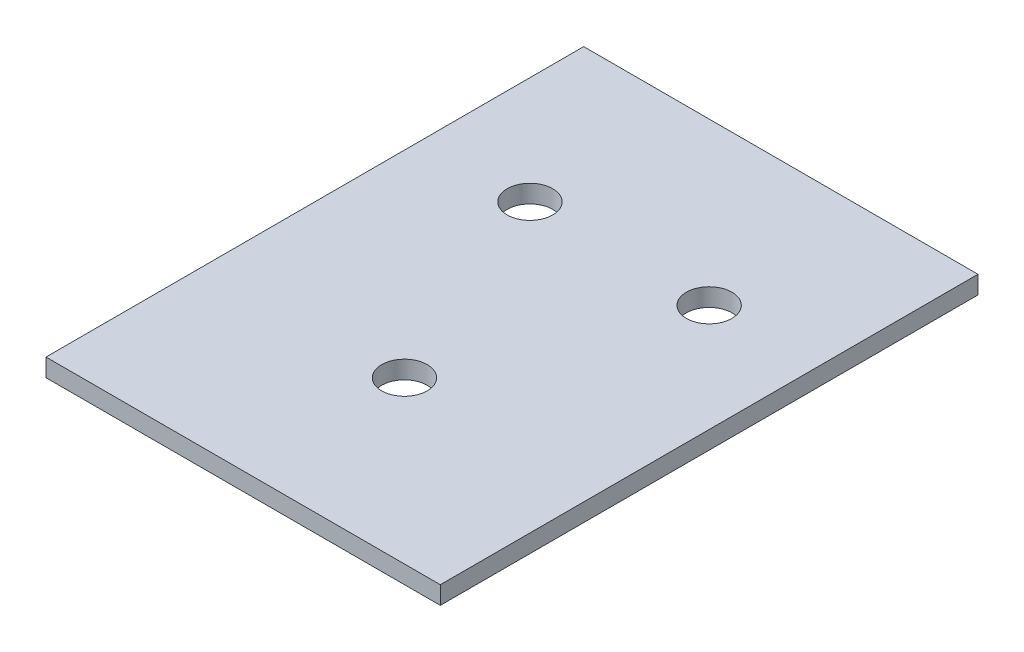
ISO-10303-21;
HEADER;
FILE_DESCRIPTION(('STEP AP214'),'2;1');
FILE_NAME('part.step','',(''),(''),'','','');
FILE_SCHEMA(('AUTOMOTIVE_DESIGN { 1 0 10303 214 1 1 1 1 }'));
ENDSEC;
DATA;
#1=APPLICATION_CONTEXT('core data for automotive mechanical design processes');
#2=APPLICATION_PROTOCOL_DEFINITION('international standard','automotive_design',2000,#1);
#3=PRODUCT_CONTEXT('',#1,'mechanical');
#4=PRODUCT('Part','Part','',(#3));
#5=PRODUCT_RELATED_PRODUCT_CATEGORY('part','',(#4));
#6=PRODUCT_DEFINITION_FORMATION('','',#4);
#7=PRODUCT_DEFINITION_CONTEXT('part definition',#1,'design');
#8=PRODUCT_DEFINITION('design','',#6,#7);
#9=PRODUCT_DEFINITION_SHAPE('','',#8);
#10=(LENGTH_UNIT() NAMED_UNIT(*) SI_UNIT(.MILLI.,.METRE.));
#11=(NAMED_UNIT(*) PLANE_ANGLE_UNIT() SI_UNIT($,.RADIAN.));
#12=(NAMED_UNIT(*) SI_UNIT($,.STERADIAN.) SOLID_ANGLE_UNIT());
#13=UNCERTAINTY_MEASURE_WITH_UNIT(LENGTH_MEASURE(1.E-05),#10,'distance_accuracy_value','');
#14=(GEOMETRIC_REPRESENTATION_CONTEXT(3) GLOBAL_UNCERTAINTY_ASSIGNED_CONTEXT((#13)) GLOBAL_UNIT_ASSIGNED_CONTEXT((#10,
#11,#12)) REPRESENTATION_CONTEXT('',''));
#15=CARTESIAN_POINT('',(0.,0.,0.));
#16=DIRECTION('',(0.,0.,1.));
#17=DIRECTION('',(1.,0.,0.));
#18=AXIS2_PLACEMENT_3D('',#15,#16,#17);
#19=CARTESIAN_POINT('',(0.,100.,210.));
#20=DIRECTION('',(0.,1.,0.));
#21=DIRECTION('',(0.,0.,1.));
#22=AXIS2_PLACEMENT_3D('',#19,#20,#21);
#23=CYLINDRICAL_SURFACE('',#22,12.7);
#24=DIRECTION('',(0.,1.,0.));
#25=VECTOR('',#24,1.);
#26=CARTESIAN_POINT('',(0.,100.,222.7));
#27=LINE('',#26,#25);
#28=CARTESIAN_POINT('',(0.,100.,222.7));
#29=VERTEX_POINT('',#28);
#30=CARTESIAN_POINT('',(0.,110.,222.7));
#31=VERTEX_POINT('',#30);
#32=EDGE_CURVE('E10',#29,#31,#27,.T.);
#33=ORIENTED_EDGE('',*,*,#32,.F.);
#34=CARTESIAN_POINT('',(0.,100.,210.));
#35=DIRECTION('',(0.,1.,0.));
#36=DIRECTION('',(0.,0.,1.));
#37=AXIS2_PLACEMENT_3D('',#34,#35,#36);
#38=CIRCLE('',#37,12.7);
#39=EDGE_CURVE('E107',#29,#29,#38,.T.);
#40=ORIENTED_EDGE('',*,*,#39,.F.);
#41=ORIENTED_EDGE('',*,*,#32,.T.);
#42=CARTESIAN_POINT('',(0.,110.,210.));
#43=DIRECTION('',(0.,1.,0.));
#44=DIRECTION('',(0.,0.,1.));
#45=AXIS2_PLACEMENT_3D('',#42,#43,#44);
#46=CIRCLE('',#45,12.7);
#47=EDGE_CURVE('E113',#31,#31,#46,.T.);
#48=ORIENTED_EDGE('',*,*,#47,.T.);
#49=EDGE_LOOP('',(#33,#40,#41,#48));
#50=FACE_BOUND('',#49,.T.);
#51=ADVANCED_FACE('F16',(#50),#23,.F.);
#52=CARTESIAN_POINT('',(50.,100.,90.));
#53=DIRECTION('',(0.,1.,0.));
#54=DIRECTION('',(0.,0.,1.));
#55=AXIS2_PLACEMENT_3D('',#52,#53,#54);
#56=CYLINDRICAL_SURFACE('',#55,12.7);
#57=DIRECTION('',(0.,1.,0.));
#58=VECTOR('',#57,1.);
#59=CARTESIAN_POINT('',(50.,100.,102.7));
#60=LINE('',#59,#58);
#61=CARTESIAN_POINT('',(50.,100.,102.7));
#62=VERTEX_POINT('',#61);
#63=CARTESIAN_POINT('',(50.,110.,102.7));
#64=VERTEX_POINT('',#63);
#65=EDGE_CURVE('E26',#62,#64,#60,.T.);
#66=ORIENTED_EDGE('',*,*,#65,.F.);
#67=CARTESIAN_POINT('',(50.,100.,90.));
#68=DIRECTION('',(0.,1.,0.));
#69=DIRECTION('',(0.,0.,1.));
#70=AXIS2_PLACEMENT_3D('',#67,#68,#69);
#71=CIRCLE('',#70,12.7);
#72=EDGE_CURVE('E99',#62,#62,#71,.T.);
#73=ORIENTED_EDGE('',*,*,#72,.F.);
#74=ORIENTED_EDGE('',*,*,#65,.T.);
#75=CARTESIAN_POINT('',(50.,110.,90.));
#76=DIRECTION('',(0.,1.,0.));
#77=DIRECTION('',(0.,0.,1.));
#78=AXIS2_PLACEMENT_3D('',#75,#76,#77);
#79=CIRCLE('',#78,12.7);
#80=EDGE_CURVE('E114',#64,#64,#79,.T.);
#81=ORIENTED_EDGE('',*,*,#80,.T.);
#82=EDGE_LOOP('',(#66,#73,#74,#81));
#83=FACE_BOUND('',#82,.T.);
#84=ADVANCED_FACE('F226',(#83),#56,.F.);
#85=CARTESIAN_POINT('',(-50.,100.,90.));
#86=DIRECTION('',(0.,1.,0.));
#87=DIRECTION('',(0.,0.,1.));
#88=AXIS2_PLACEMENT_3D('',#85,#86,#87);
#89=CYLINDRICAL_SURFACE('',#88,12.7);
#90=DIRECTION('',(0.,1.,0.));
#91=VECTOR('',#90,1.);
#92=CARTESIAN_POINT('',(-50.,100.,102.7));
#93=LINE('',#92,#91);
#94=CARTESIAN_POINT('',(-50.,100.,102.7));
#95=VERTEX_POINT('',#94);
#96=CARTESIAN_POINT('',(-50.,110.,102.7));
#97=VERTEX_POINT('',#96);
#98=EDGE_CURVE('E86',#95,#97,#93,.T.);
#99=ORIENTED_EDGE('',*,*,#98,.F.);
#100=CARTESIAN_POINT('',(-50.,100.,90.));
#101=DIRECTION('',(0.,1.,0.));
#102=DIRECTION('',(0.,0.,1.));
#103=AXIS2_PLACEMENT_3D('',#100,#101,#102);
#104=CIRCLE('',#103,12.7);
#105=EDGE_CURVE('E89',#95,#95,#104,.T.);
#106=ORIENTED_EDGE('',*,*,#105,.F.);
#107=ORIENTED_EDGE('',*,*,#98,.T.);
#108=CARTESIAN_POINT('',(-50.,110.,90.));
#109=DIRECTION('',(0.,1.,0.));
#110=DIRECTION('',(0.,0.,1.));
#111=AXIS2_PLACEMENT_3D('',#108,#109,#110);
#112=CIRCLE('',#111,12.7);
#113=EDGE_CURVE('E91',#97,#97,#112,.T.);
#114=ORIENTED_EDGE('',*,*,#113,.T.);
#115=EDGE_LOOP('',(#99,#106,#107,#114));
#116=FACE_BOUND('',#115,.T.);
#117=ADVANCED_FACE('F88',(#116),#89,.F.);
#118=CARTESIAN_POINT('',(110.,100.,0.));
#119=DIRECTION('',(1.,0.,0.));
#120=DIRECTION('',(0.,1.,0.));
#121=AXIS2_PLACEMENT_3D('',#118,#119,#120);
#122=PLANE('',#121);
#123=DIRECTION('',(0.,0.,1.));
#124=VECTOR('',#123,1.);
#125=CARTESIAN_POINT('',(110.,100.,0.));
#126=LINE('',#125,#124);
#127=CARTESIAN_POINT('',(110.,100.,0.));
#128=VERTEX_POINT('',#127);
#129=CARTESIAN_POINT('',(110.,100.,300.));
#130=VERTEX_POINT('',#129);
#131=EDGE_CURVE('E140',#128,#130,#126,.T.);
#132=ORIENTED_EDGE('',*,*,#131,.F.);
#133=DIRECTION('',(0.,1.,0.));
#134=VECTOR('',#133,1.);
#135=CARTESIAN_POINT('',(110.,100.,0.));
#136=LINE('',#135,#134);
#137=CARTESIAN_POINT('',(110.,110.,0.));
#138=VERTEX_POINT('',#137);
#139=EDGE_CURVE('E93',#128,#138,#136,.T.);
#140=ORIENTED_EDGE('',*,*,#139,.T.);
#141=DIRECTION('',(0.,0.,1.));
#142=VECTOR('',#141,1.);
#143=CARTESIAN_POINT('',(110.,110.,0.));
#144=LINE('',#143,#142);
#145=CARTESIAN_POINT('',(110.,110.,300.));
#146=VERTEX_POINT('',#145);
#147=EDGE_CURVE('E120',#138,#146,#144,.T.);
#148=ORIENTED_EDGE('',*,*,#147,.T.);
#149=DIRECTION('',(0.,1.,0.));
#150=VECTOR('',#149,1.);
#151=CARTESIAN_POINT('',(110.,100.,300.));
#152=LINE('',#151,#150);
#153=EDGE_CURVE('E130',#130,#146,#152,.T.);
#154=ORIENTED_EDGE('',*,*,#153,.F.);
#155=EDGE_LOOP('',(#132,#140,#148,#154));
#156=FACE_BOUND('',#155,.T.);
#157=ADVANCED_FACE('F166',(#156),#122,.T.);
#158=CARTESIAN_POINT('',(-110.,100.,0.));
#159=DIRECTION('',(0.,0.,1.));
#160=DIRECTION('',(1.,0.,0.));
#161=AXIS2_PLACEMENT_3D('',#158,#159,#160);
#162=PLANE('',#161);
#163=DIRECTION('',(1.,0.,0.));
#164=VECTOR('',#163,1.);
#165=CARTESIAN_POINT('',(-110.,110.,0.));
#166=LINE('',#165,#164);
#167=CARTESIAN_POINT('',(-110.,110.,0.));
#168=VERTEX_POINT('',#167);
#169=EDGE_CURVE('E116',#168,#138,#166,.T.);
#170=ORIENTED_EDGE('',*,*,#169,.T.);
#171=ORIENTED_EDGE('',*,*,#139,.F.);
#172=DIRECTION('',(1.,0.,0.));
#173=VECTOR('',#172,1.);
#174=CARTESIAN_POINT('',(-110.,100.,0.));
#175=LINE('',#174,#173);
#176=CARTESIAN_POINT('',(-110.,100.,0.));
#177=VERTEX_POINT('',#176);
#178=EDGE_CURVE('E100',#177,#128,#175,.T.);
#179=ORIENTED_EDGE('',*,*,#178,.F.);
#180=DIRECTION('',(0.,1.,0.));
#181=VECTOR('',#180,1.);
#182=CARTESIAN_POINT('',(-110.,100.,0.));
#183=LINE('',#182,#181);
#184=EDGE_CURVE('E126',#177,#168,#183,.T.);
#185=ORIENTED_EDGE('',*,*,#184,.T.);
#186=EDGE_LOOP('',(#170,#171,#179,#185));
#187=FACE_BOUND('',#186,.T.);
#188=ADVANCED_FACE('F178',(#187),#162,.F.);
#189=CARTESIAN_POINT('',(-110.,110.,0.));
#190=DIRECTION('',(0.,1.,0.));
#191=DIRECTION('',(1.,0.,0.));
#192=AXIS2_PLACEMENT_3D('',#189,#190,#191);
#193=PLANE('',#192);
#194=ORIENTED_EDGE('',*,*,#47,.F.);
#195=EDGE_LOOP('',(#194));
#196=FACE_BOUND('',#195,.T.);
#197=ORIENTED_EDGE('',*,*,#80,.F.);
#198=EDGE_LOOP('',(#197));
#199=FACE_BOUND('',#198,.T.);
#200=ORIENTED_EDGE('',*,*,#113,.F.);
#201=EDGE_LOOP('',(#200));
#202=FACE_BOUND('',#201,.T.);
#203=ORIENTED_EDGE('',*,*,#169,.F.);
#204=DIRECTION('',(0.,0.,1.));
#205=VECTOR('',#204,1.);
#206=CARTESIAN_POINT('',(-110.,110.,0.));
#207=LINE('',#206,#205);
#208=CARTESIAN_POINT('',(-110.,110.,300.));
#209=VERTEX_POINT('',#208);
#210=EDGE_CURVE('E122',#168,#209,#207,.T.);
#211=ORIENTED_EDGE('',*,*,#210,.T.);
#212=DIRECTION('',(1.,0.,0.));
#213=VECTOR('',#212,1.);
#214=CARTESIAN_POINT('',(-110.,110.,300.));
#215=LINE('',#214,#213);
#216=EDGE_CURVE('E121',#209,#146,#215,.T.);
#217=ORIENTED_EDGE('',*,*,#216,.T.);
#218=ORIENTED_EDGE('',*,*,#147,.F.);
#219=EDGE_LOOP('',(#203,#211,#217,#218));
#220=FACE_BOUND('',#219,.T.);
#221=ADVANCED_FACE('F168',(#196,#199,#202,#220),#193,.T.);
#222=CARTESIAN_POINT('',(-110.,100.,300.));
#223=DIRECTION('',(0.,0.,1.));
#224=DIRECTION('',(1.,0.,0.));
#225=AXIS2_PLACEMENT_3D('',#222,#223,#224);
#226=PLANE('',#225);
#227=DIRECTION('',(0.,1.,0.));
#228=VECTOR('',#227,1.);
#229=CARTESIAN_POINT('',(-110.,100.,300.));
#230=LINE('',#229,#228);
#231=CARTESIAN_POINT('',(-110.,100.,300.));
#232=VERTEX_POINT('',#231);
#233=EDGE_CURVE('E19',#232,#209,#230,.T.);
#234=ORIENTED_EDGE('',*,*,#233,.F.);
#235=DIRECTION('',(1.,0.,0.));
#236=VECTOR('',#235,1.);
#237=CARTESIAN_POINT('',(-110.,100.,300.));
#238=LINE('',#237,#236);
#239=EDGE_CURVE('E110',#232,#130,#238,.T.);
#240=ORIENTED_EDGE('',*,*,#239,.T.);
#241=ORIENTED_EDGE('',*,*,#153,.T.);
#242=ORIENTED_EDGE('',*,*,#216,.F.);
#243=EDGE_LOOP('',(#234,#240,#241,#242));
#244=FACE_BOUND('',#243,.T.);
#245=ADVANCED_FACE('F173',(#244),#226,.T.);
#246=CARTESIAN_POINT('',(-110.,100.,0.));
#247=DIRECTION('',(0.,1.,0.));
#248=DIRECTION('',(1.,0.,0.));
#249=AXIS2_PLACEMENT_3D('',#246,#247,#248);
#250=PLANE('',#249);
#251=ORIENTED_EDGE('',*,*,#39,.T.);
#252=EDGE_LOOP('',(#251));
#253=FACE_BOUND('',#252,.T.);
#254=ORIENTED_EDGE('',*,*,#72,.T.);
#255=EDGE_LOOP('',(#254));
#256=FACE_BOUND('',#255,.T.);
#257=ORIENTED_EDGE('',*,*,#105,.T.);
#258=EDGE_LOOP('',(#257));
#259=FACE_BOUND('',#258,.T.);
#260=ORIENTED_EDGE('',*,*,#131,.T.);
#261=ORIENTED_EDGE('',*,*,#239,.F.);
#262=DIRECTION('',(0.,0.,1.));
#263=VECTOR('',#262,1.);
#264=CARTESIAN_POINT('',(-110.,100.,0.));
#265=LINE('',#264,#263);
#266=EDGE_CURVE('E134',#177,#232,#265,.T.);
#267=ORIENTED_EDGE('',*,*,#266,.F.);
#268=ORIENTED_EDGE('',*,*,#178,.T.);
#269=EDGE_LOOP('',(#260,#261,#267,#268));
#270=FACE_BOUND('',#269,.T.);
#271=ADVANCED_FACE('F96',(#253,#256,#259,#270),#250,.F.);
#272=CARTESIAN_POINT('',(-110.,100.,0.));
#273=DIRECTION('',(1.,0.,0.));
#274=DIRECTION('',(0.,1.,0.));
#275=AXIS2_PLACEMENT_3D('',#272,#273,#274);
#276=PLANE('',#275);
#277=ORIENTED_EDGE('',*,*,#233,.T.);
#278=ORIENTED_EDGE('',*,*,#210,.F.);
#279=ORIENTED_EDGE('',*,*,#184,.F.);
#280=ORIENTED_EDGE('',*,*,#266,.T.);
#281=EDGE_LOOP('',(#277,#278,#279,#280));
#282=FACE_BOUND('',#281,.T.);
#283=ADVANCED_FACE('F261',(#282),#276,.F.);
#284=CLOSED_SHELL('',(#51,#84,#117,#157,#188,#221,#245,#271,#283));
#285=MANIFOLD_SOLID_BREP('B1',#284);
#286=ADVANCED_BREP_SHAPE_REPRESENTATION('',(#18,#285),#14);
#287=SHAPE_DEFINITION_REPRESENTATION(#9,#286);
ENDSEC;
END-ISO-10303-21;
